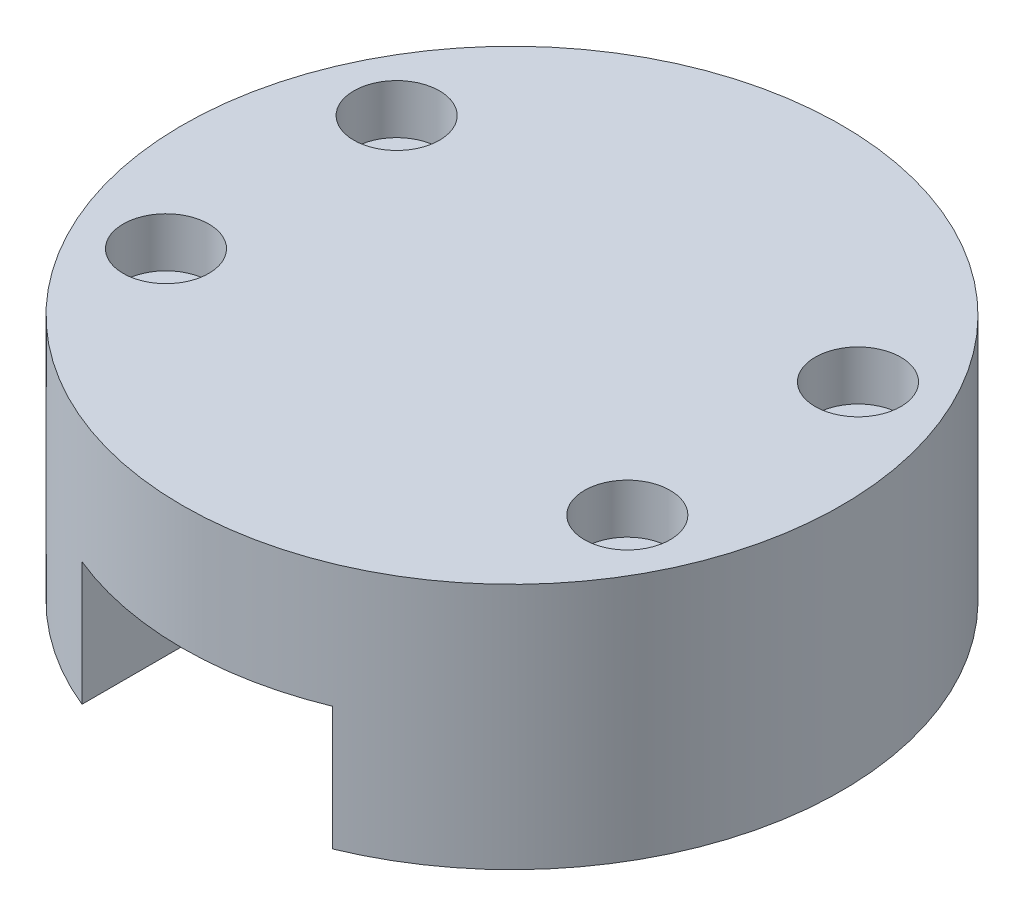
ISO-10303-21;
HEADER;
FILE_DESCRIPTION(('STEP AP214'),'2;1');
FILE_NAME('part.step','',(''),(''),'','','');
FILE_SCHEMA(('AUTOMOTIVE_DESIGN { 1 0 10303 214 1 1 1 1 }'));
ENDSEC;
DATA;
#1=APPLICATION_CONTEXT('core data for automotive mechanical design processes');
#2=APPLICATION_PROTOCOL_DEFINITION('international standard','automotive_design',2000,#1);
#3=PRODUCT_CONTEXT('',#1,'mechanical');
#4=PRODUCT('Part','Part','',(#3));
#5=PRODUCT_RELATED_PRODUCT_CATEGORY('part','',(#4));
#6=PRODUCT_DEFINITION_FORMATION('','',#4);
#7=PRODUCT_DEFINITION_CONTEXT('part definition',#1,'design');
#8=PRODUCT_DEFINITION('design','',#6,#7);
#9=PRODUCT_DEFINITION_SHAPE('','',#8);
#10=(LENGTH_UNIT() NAMED_UNIT(*) SI_UNIT(.MILLI.,.METRE.));
#11=(NAMED_UNIT(*) PLANE_ANGLE_UNIT() SI_UNIT($,.RADIAN.));
#12=(NAMED_UNIT(*) SI_UNIT($,.STERADIAN.) SOLID_ANGLE_UNIT());
#13=UNCERTAINTY_MEASURE_WITH_UNIT(LENGTH_MEASURE(1.E-05),#10,'distance_accuracy_value','');
#14=(GEOMETRIC_REPRESENTATION_CONTEXT(3) GLOBAL_UNCERTAINTY_ASSIGNED_CONTEXT((#13)) GLOBAL_UNIT_ASSIGNED_CONTEXT((#10,
#11,#12)) REPRESENTATION_CONTEXT('',''));
#15=CARTESIAN_POINT('',(0.,0.,0.));
#16=DIRECTION('',(0.,0.,1.));
#17=DIRECTION('',(1.,0.,0.));
#18=AXIS2_PLACEMENT_3D('',#15,#16,#17);
#19=CARTESIAN_POINT('',(-14.,15.001,7.));
#20=DIRECTION('',(0.,-1.,0.));
#21=DIRECTION('',(0.,0.,-1.));
#22=AXIS2_PLACEMENT_3D('',#19,#20,#21);
#23=CYLINDRICAL_SURFACE('',#22,1.5);
#24=CARTESIAN_POINT('',(-14.,0.,7.));
#25=DIRECTION('',(0.,-1.,0.));
#26=DIRECTION('',(0.,0.,-1.));
#27=AXIS2_PLACEMENT_3D('',#24,#25,#26);
#28=CIRCLE('',#27,1.5);
#29=CARTESIAN_POINT('',(-14.,0.,5.5));
#30=VERTEX_POINT('',#29);
#31=EDGE_CURVE('E83',#30,#30,#28,.T.);
#32=CARTESIAN_POINT('',(-14.,12.,7.));
#33=DIRECTION('',(0.,1.,0.));
#34=DIRECTION('',(0.,0.,1.));
#35=AXIS2_PLACEMENT_3D('',#32,#33,#34);
#36=CIRCLE('',#35,1.5);
#37=CARTESIAN_POINT('',(-14.,12.,5.5));
#38=VERTEX_POINT('',#37);
#39=EDGE_CURVE('E37',#38,#38,#36,.F.);
#40=CARTESIAN_POINT('',(-14.,0.,5.5));
#41=CARTESIAN_POINT('',(-14.,0.125,5.5));
#42=CARTESIAN_POINT('',(-14.,0.25,5.5));
#43=CARTESIAN_POINT('',(-14.,0.5,5.5));
#44=CARTESIAN_POINT('',(-14.,0.625000000000001,5.5));
#45=CARTESIAN_POINT('',(-14.,0.875000000000001,5.5));
#46=CARTESIAN_POINT('',(-14.,1.,5.5));
#47=CARTESIAN_POINT('',(-14.,1.25,5.5));
#48=CARTESIAN_POINT('',(-14.,1.375,5.5));
#49=CARTESIAN_POINT('',(-14.,1.625,5.5));
#50=CARTESIAN_POINT('',(-14.,1.75,5.5));
#51=CARTESIAN_POINT('',(-14.,2.,5.5));
#52=CARTESIAN_POINT('',(-14.,2.125,5.5));
#53=CARTESIAN_POINT('',(-14.,2.375,5.5));
#54=CARTESIAN_POINT('',(-14.,2.5,5.5));
#55=CARTESIAN_POINT('',(-14.,2.75,5.5));
#56=CARTESIAN_POINT('',(-14.,2.875,5.5));
#57=CARTESIAN_POINT('',(-14.,3.125,5.5));
#58=CARTESIAN_POINT('',(-14.,3.25,5.5));
#59=CARTESIAN_POINT('',(-14.,3.5,5.5));
#60=CARTESIAN_POINT('',(-14.,3.625,5.5));
#61=CARTESIAN_POINT('',(-14.,3.875,5.5));
#62=CARTESIAN_POINT('',(-14.,4.,5.5));
#63=CARTESIAN_POINT('',(-14.,4.25,5.5));
#64=CARTESIAN_POINT('',(-14.,4.375,5.5));
#65=CARTESIAN_POINT('',(-14.,4.625,5.5));
#66=CARTESIAN_POINT('',(-14.,4.75,5.5));
#67=CARTESIAN_POINT('',(-14.,5.,5.5));
#68=CARTESIAN_POINT('',(-14.,5.125,5.5));
#69=CARTESIAN_POINT('',(-14.,5.375,5.5));
#70=CARTESIAN_POINT('',(-14.,5.5,5.5));
#71=CARTESIAN_POINT('',(-14.,5.75,5.5));
#72=CARTESIAN_POINT('',(-14.,5.875,5.5));
#73=CARTESIAN_POINT('',(-14.,6.125,5.5));
#74=CARTESIAN_POINT('',(-14.,6.25,5.5));
#75=CARTESIAN_POINT('',(-14.,6.5,5.5));
#76=CARTESIAN_POINT('',(-14.,6.625,5.5));
#77=CARTESIAN_POINT('',(-14.,6.875,5.5));
#78=CARTESIAN_POINT('',(-14.,7.,5.5));
#79=CARTESIAN_POINT('',(-14.,7.25,5.5));
#80=CARTESIAN_POINT('',(-14.,7.375,5.5));
#81=CARTESIAN_POINT('',(-14.,7.625,5.5));
#82=CARTESIAN_POINT('',(-14.,7.75,5.5));
#83=CARTESIAN_POINT('',(-14.,8.,5.5));
#84=CARTESIAN_POINT('',(-14.,8.125,5.5));
#85=CARTESIAN_POINT('',(-14.,8.375,5.5));
#86=CARTESIAN_POINT('',(-14.,8.5,5.5));
#87=CARTESIAN_POINT('',(-14.,8.75,5.5));
#88=CARTESIAN_POINT('',(-14.,8.875,5.5));
#89=CARTESIAN_POINT('',(-14.,9.125,5.5));
#90=CARTESIAN_POINT('',(-14.,9.25,5.5));
#91=CARTESIAN_POINT('',(-14.,9.5,5.5));
#92=CARTESIAN_POINT('',(-14.,9.625,5.5));
#93=CARTESIAN_POINT('',(-14.,9.875,5.5));
#94=CARTESIAN_POINT('',(-14.,10.,5.5));
#95=CARTESIAN_POINT('',(-14.,10.25,5.5));
#96=CARTESIAN_POINT('',(-14.,10.375,5.5));
#97=CARTESIAN_POINT('',(-14.,10.625,5.5));
#98=CARTESIAN_POINT('',(-14.,10.75,5.5));
#99=CARTESIAN_POINT('',(-14.,11.,5.5));
#100=CARTESIAN_POINT('',(-14.,11.125,5.5));
#101=CARTESIAN_POINT('',(-14.,11.375,5.5));
#102=CARTESIAN_POINT('',(-14.,11.5,5.5));
#103=CARTESIAN_POINT('',(-14.,11.75,5.5));
#104=CARTESIAN_POINT('',(-14.,11.875,5.5));
#105=CARTESIAN_POINT('',(-14.,12.,5.5));
#106=B_SPLINE_CURVE_WITH_KNOTS('',3,(#40,#41,#42,#43,#44,#45,#46,#47,#48,#49,#50,#51,#52,#53,
#54,#55,#56,#57,#58,#59,#60,#61,#62,#63,#64,#65,#66,#67,#68,#69,#70,#71,#72,#73,#74,#75,#76,#77,
#78,#79,#80,#81,#82,#83,#84,#85,#86,#87,#88,#89,#90,#91,#92,#93,#94,#95,#96,#97,#98,#99,#100,
#101,#102,#103,#104,#105),.UNSPECIFIED.,.F.,.F.,(4,2,2,2,2,2,2,2,2,2,2,2,2,2,2,2,2,2,2,2,2,2,2,
2,2,2,2,2,2,2,2,2,4),(0.,0.375,0.750000000000001,1.125,1.5,1.875,2.25,2.625,3.,3.375,3.75,4.125,
4.5,4.875,5.25,5.625,6.,6.375,6.75,7.125,7.5,7.875,8.25,8.625,9.,9.375,9.75,10.125,10.5,10.875,
11.25,11.625,12.),.UNSPECIFIED.);
#107=EDGE_CURVE('BSEAM33',#30,#38,#106,.T.);
#108=ORIENTED_EDGE('',*,*,#31,.T.);
#109=ORIENTED_EDGE('',*,*,#39,.F.);
#110=ORIENTED_EDGE('',*,*,#107,.T.);
#111=ORIENTED_EDGE('',*,*,#107,.F.);
#112=EDGE_LOOP('',(#108,#110,#109,#111));
#113=FACE_BOUND('',#112,.T.);
#114=ADVANCED_FACE('F33',(#113),#23,.F.);
#115=CARTESIAN_POINT('',(14.,15.001,-7.));
#116=DIRECTION('',(0.,-1.,0.));
#117=DIRECTION('',(0.,0.,-1.));
#118=AXIS2_PLACEMENT_3D('',#115,#116,#117);
#119=CYLINDRICAL_SURFACE('',#118,1.5);
#120=CARTESIAN_POINT('',(14.,0.,-7.));
#121=DIRECTION('',(0.,-1.,0.));
#122=DIRECTION('',(0.,0.,-1.));
#123=AXIS2_PLACEMENT_3D('',#120,#121,#122);
#124=CIRCLE('',#123,1.5);
#125=CARTESIAN_POINT('',(14.,0.,-8.5));
#126=VERTEX_POINT('',#125);
#127=EDGE_CURVE('E117',#126,#126,#124,.T.);
#128=CARTESIAN_POINT('',(14.,12.,-7.));
#129=DIRECTION('',(0.,1.,0.));
#130=DIRECTION('',(0.,0.,1.));
#131=AXIS2_PLACEMENT_3D('',#128,#129,#130);
#132=CIRCLE('',#131,1.5);
#133=CARTESIAN_POINT('',(14.,12.,-8.5));
#134=VERTEX_POINT('',#133);
#135=EDGE_CURVE('E112',#134,#134,#132,.F.);
#136=CARTESIAN_POINT('',(14.,0.,-8.5));
#137=CARTESIAN_POINT('',(14.,0.125,-8.5));
#138=CARTESIAN_POINT('',(14.,0.25,-8.5));
#139=CARTESIAN_POINT('',(14.,0.5,-8.5));
#140=CARTESIAN_POINT('',(14.,0.625000000000001,-8.5));
#141=CARTESIAN_POINT('',(14.,0.875000000000001,-8.5));
#142=CARTESIAN_POINT('',(14.,1.,-8.5));
#143=CARTESIAN_POINT('',(14.,1.25,-8.5));
#144=CARTESIAN_POINT('',(14.,1.375,-8.5));
#145=CARTESIAN_POINT('',(14.,1.625,-8.5));
#146=CARTESIAN_POINT('',(14.,1.75,-8.5));
#147=CARTESIAN_POINT('',(14.,2.,-8.5));
#148=CARTESIAN_POINT('',(14.,2.125,-8.5));
#149=CARTESIAN_POINT('',(14.,2.375,-8.5));
#150=CARTESIAN_POINT('',(14.,2.5,-8.5));
#151=CARTESIAN_POINT('',(14.,2.75,-8.5));
#152=CARTESIAN_POINT('',(14.,2.875,-8.5));
#153=CARTESIAN_POINT('',(14.,3.125,-8.5));
#154=CARTESIAN_POINT('',(14.,3.25,-8.5));
#155=CARTESIAN_POINT('',(14.,3.5,-8.5));
#156=CARTESIAN_POINT('',(14.,3.625,-8.5));
#157=CARTESIAN_POINT('',(14.,3.875,-8.5));
#158=CARTESIAN_POINT('',(14.,4.,-8.5));
#159=CARTESIAN_POINT('',(14.,4.25,-8.5));
#160=CARTESIAN_POINT('',(14.,4.375,-8.5));
#161=CARTESIAN_POINT('',(14.,4.625,-8.5));
#162=CARTESIAN_POINT('',(14.,4.75,-8.5));
#163=CARTESIAN_POINT('',(14.,5.,-8.5));
#164=CARTESIAN_POINT('',(14.,5.125,-8.5));
#165=CARTESIAN_POINT('',(14.,5.375,-8.5));
#166=CARTESIAN_POINT('',(14.,5.5,-8.5));
#167=CARTESIAN_POINT('',(14.,5.75,-8.5));
#168=CARTESIAN_POINT('',(14.,5.875,-8.5));
#169=CARTESIAN_POINT('',(14.,6.125,-8.5));
#170=CARTESIAN_POINT('',(14.,6.25,-8.5));
#171=CARTESIAN_POINT('',(14.,6.5,-8.5));
#172=CARTESIAN_POINT('',(14.,6.625,-8.5));
#173=CARTESIAN_POINT('',(14.,6.875,-8.5));
#174=CARTESIAN_POINT('',(14.,7.,-8.5));
#175=CARTESIAN_POINT('',(14.,7.25,-8.5));
#176=CARTESIAN_POINT('',(14.,7.375,-8.5));
#177=CARTESIAN_POINT('',(14.,7.625,-8.5));
#178=CARTESIAN_POINT('',(14.,7.75,-8.5));
#179=CARTESIAN_POINT('',(14.,8.,-8.5));
#180=CARTESIAN_POINT('',(14.,8.125,-8.5));
#181=CARTESIAN_POINT('',(14.,8.375,-8.5));
#182=CARTESIAN_POINT('',(14.,8.5,-8.5));
#183=CARTESIAN_POINT('',(14.,8.75,-8.5));
#184=CARTESIAN_POINT('',(14.,8.875,-8.5));
#185=CARTESIAN_POINT('',(14.,9.125,-8.5));
#186=CARTESIAN_POINT('',(14.,9.25,-8.5));
#187=CARTESIAN_POINT('',(14.,9.5,-8.5));
#188=CARTESIAN_POINT('',(14.,9.625,-8.5));
#189=CARTESIAN_POINT('',(14.,9.875,-8.5));
#190=CARTESIAN_POINT('',(14.,10.,-8.5));
#191=CARTESIAN_POINT('',(14.,10.25,-8.5));
#192=CARTESIAN_POINT('',(14.,10.375,-8.5));
#193=CARTESIAN_POINT('',(14.,10.625,-8.5));
#194=CARTESIAN_POINT('',(14.,10.75,-8.5));
#195=CARTESIAN_POINT('',(14.,11.,-8.5));
#196=CARTESIAN_POINT('',(14.,11.125,-8.5));
#197=CARTESIAN_POINT('',(14.,11.375,-8.5));
#198=CARTESIAN_POINT('',(14.,11.5,-8.5));
#199=CARTESIAN_POINT('',(14.,11.75,-8.5));
#200=CARTESIAN_POINT('',(14.,11.875,-8.5));
#201=CARTESIAN_POINT('',(14.,12.,-8.5));
#202=B_SPLINE_CURVE_WITH_KNOTS('',3,(#136,#137,#138,#139,#140,#141,#142,#143,#144,#145,#146,
#147,#148,#149,#150,#151,#152,#153,#154,#155,#156,#157,#158,#159,#160,#161,#162,#163,#164,#165,
#166,#167,#168,#169,#170,#171,#172,#173,#174,#175,#176,#177,#178,#179,#180,#181,#182,#183,#184,
#185,#186,#187,#188,#189,#190,#191,#192,#193,#194,#195,#196,#197,#198,#199,#200,#201),
.UNSPECIFIED.,.F.,.F.,(4,2,2,2,2,2,2,2,2,2,2,2,2,2,2,2,2,2,2,2,2,2,2,2,2,2,2,2,2,2,2,2,4),(0.,
0.375,0.750000000000001,1.125,1.5,1.875,2.25,2.625,3.,3.375,3.75,4.125,4.5,4.875,5.25,5.625,6.,
6.375,6.75,7.125,7.5,7.875,8.25,8.625,9.,9.375,9.75,10.125,10.5,10.875,11.25,11.625,12.),.UNSPECIFIED.);
#203=EDGE_CURVE('BSEAM157',#126,#134,#202,.T.);
#204=ORIENTED_EDGE('',*,*,#127,.T.);
#205=ORIENTED_EDGE('',*,*,#135,.F.);
#206=ORIENTED_EDGE('',*,*,#203,.T.);
#207=ORIENTED_EDGE('',*,*,#203,.F.);
#208=EDGE_LOOP('',(#204,#206,#205,#207));
#209=FACE_BOUND('',#208,.T.);
#210=ADVANCED_FACE('F157',(#209),#119,.F.);
#211=CARTESIAN_POINT('',(14.,15.001,7.));
#212=DIRECTION('',(0.,-1.,0.));
#213=DIRECTION('',(0.,0.,-1.));
#214=AXIS2_PLACEMENT_3D('',#211,#212,#213);
#215=CYLINDRICAL_SURFACE('',#214,1.5);
#216=CARTESIAN_POINT('',(14.,0.,7.));
#217=DIRECTION('',(0.,-1.,0.));
#218=DIRECTION('',(0.,0.,-1.));
#219=AXIS2_PLACEMENT_3D('',#216,#217,#218);
#220=CIRCLE('',#219,1.5);
#221=CARTESIAN_POINT('',(14.,0.,5.5));
#222=VERTEX_POINT('',#221);
#223=EDGE_CURVE('E121',#222,#222,#220,.T.);
#224=CARTESIAN_POINT('',(14.,12.,7.));
#225=DIRECTION('',(0.,1.,0.));
#226=DIRECTION('',(0.,0.,1.));
#227=AXIS2_PLACEMENT_3D('',#224,#225,#226);
#228=CIRCLE('',#227,1.5);
#229=CARTESIAN_POINT('',(14.,12.,5.5));
#230=VERTEX_POINT('',#229);
#231=EDGE_CURVE('E109',#230,#230,#228,.F.);
#232=CARTESIAN_POINT('',(14.,0.,5.5));
#233=CARTESIAN_POINT('',(14.,0.125,5.5));
#234=CARTESIAN_POINT('',(14.,0.25,5.5));
#235=CARTESIAN_POINT('',(14.,0.5,5.5));
#236=CARTESIAN_POINT('',(14.,0.625000000000001,5.5));
#237=CARTESIAN_POINT('',(14.,0.875000000000001,5.5));
#238=CARTESIAN_POINT('',(14.,1.,5.5));
#239=CARTESIAN_POINT('',(14.,1.25,5.5));
#240=CARTESIAN_POINT('',(14.,1.375,5.5));
#241=CARTESIAN_POINT('',(14.,1.625,5.5));
#242=CARTESIAN_POINT('',(14.,1.75,5.5));
#243=CARTESIAN_POINT('',(14.,2.,5.5));
#244=CARTESIAN_POINT('',(14.,2.125,5.5));
#245=CARTESIAN_POINT('',(14.,2.375,5.5));
#246=CARTESIAN_POINT('',(14.,2.5,5.5));
#247=CARTESIAN_POINT('',(14.,2.75,5.5));
#248=CARTESIAN_POINT('',(14.,2.875,5.5));
#249=CARTESIAN_POINT('',(14.,3.125,5.5));
#250=CARTESIAN_POINT('',(14.,3.25,5.5));
#251=CARTESIAN_POINT('',(14.,3.5,5.5));
#252=CARTESIAN_POINT('',(14.,3.625,5.5));
#253=CARTESIAN_POINT('',(14.,3.875,5.5));
#254=CARTESIAN_POINT('',(14.,4.,5.5));
#255=CARTESIAN_POINT('',(14.,4.25,5.5));
#256=CARTESIAN_POINT('',(14.,4.375,5.5));
#257=CARTESIAN_POINT('',(14.,4.625,5.5));
#258=CARTESIAN_POINT('',(14.,4.75,5.5));
#259=CARTESIAN_POINT('',(14.,5.,5.5));
#260=CARTESIAN_POINT('',(14.,5.125,5.5));
#261=CARTESIAN_POINT('',(14.,5.375,5.5));
#262=CARTESIAN_POINT('',(14.,5.5,5.5));
#263=CARTESIAN_POINT('',(14.,5.75,5.5));
#264=CARTESIAN_POINT('',(14.,5.875,5.5));
#265=CARTESIAN_POINT('',(14.,6.125,5.5));
#266=CARTESIAN_POINT('',(14.,6.25,5.5));
#267=CARTESIAN_POINT('',(14.,6.5,5.5));
#268=CARTESIAN_POINT('',(14.,6.625,5.5));
#269=CARTESIAN_POINT('',(14.,6.875,5.5));
#270=CARTESIAN_POINT('',(14.,7.,5.5));
#271=CARTESIAN_POINT('',(14.,7.25,5.5));
#272=CARTESIAN_POINT('',(14.,7.375,5.5));
#273=CARTESIAN_POINT('',(14.,7.625,5.5));
#274=CARTESIAN_POINT('',(14.,7.75,5.5));
#275=CARTESIAN_POINT('',(14.,8.,5.5));
#276=CARTESIAN_POINT('',(14.,8.125,5.5));
#277=CARTESIAN_POINT('',(14.,8.375,5.5));
#278=CARTESIAN_POINT('',(14.,8.5,5.5));
#279=CARTESIAN_POINT('',(14.,8.75,5.5));
#280=CARTESIAN_POINT('',(14.,8.875,5.5));
#281=CARTESIAN_POINT('',(14.,9.125,5.5));
#282=CARTESIAN_POINT('',(14.,9.25,5.5));
#283=CARTESIAN_POINT('',(14.,9.5,5.5));
#284=CARTESIAN_POINT('',(14.,9.625,5.5));
#285=CARTESIAN_POINT('',(14.,9.875,5.5));
#286=CARTESIAN_POINT('',(14.,10.,5.5));
#287=CARTESIAN_POINT('',(14.,10.25,5.5));
#288=CARTESIAN_POINT('',(14.,10.375,5.5));
#289=CARTESIAN_POINT('',(14.,10.625,5.5));
#290=CARTESIAN_POINT('',(14.,10.75,5.5));
#291=CARTESIAN_POINT('',(14.,11.,5.5));
#292=CARTESIAN_POINT('',(14.,11.125,5.5));
#293=CARTESIAN_POINT('',(14.,11.375,5.5));
#294=CARTESIAN_POINT('',(14.,11.5,5.5));
#295=CARTESIAN_POINT('',(14.,11.75,5.5));
#296=CARTESIAN_POINT('',(14.,11.875,5.5));
#297=CARTESIAN_POINT('',(14.,12.,5.5));
#298=B_SPLINE_CURVE_WITH_KNOTS('',3,(#232,#233,#234,#235,#236,#237,#238,#239,#240,#241,#242,
#243,#244,#245,#246,#247,#248,#249,#250,#251,#252,#253,#254,#255,#256,#257,#258,#259,#260,#261,
#262,#263,#264,#265,#266,#267,#268,#269,#270,#271,#272,#273,#274,#275,#276,#277,#278,#279,#280,
#281,#282,#283,#284,#285,#286,#287,#288,#289,#290,#291,#292,#293,#294,#295,#296,#297),
.UNSPECIFIED.,.F.,.F.,(4,2,2,2,2,2,2,2,2,2,2,2,2,2,2,2,2,2,2,2,2,2,2,2,2,2,2,2,2,2,2,2,4),(0.,
0.375,0.750000000000001,1.125,1.5,1.875,2.25,2.625,3.,3.375,3.75,4.125,4.5,4.875,5.25,5.625,6.,
6.375,6.75,7.125,7.5,7.875,8.25,8.625,9.,9.375,9.75,10.125,10.5,10.875,11.25,11.625,12.),.UNSPECIFIED.);
#299=EDGE_CURVE('BSEAM163',#222,#230,#298,.T.);
#300=ORIENTED_EDGE('',*,*,#223,.T.);
#301=ORIENTED_EDGE('',*,*,#231,.F.);
#302=ORIENTED_EDGE('',*,*,#299,.T.);
#303=ORIENTED_EDGE('',*,*,#299,.F.);
#304=EDGE_LOOP('',(#300,#302,#301,#303));
#305=FACE_BOUND('',#304,.T.);
#306=ADVANCED_FACE('F163',(#305),#215,.F.);
#307=CARTESIAN_POINT('',(-14.,15.001,-7.));
#308=DIRECTION('',(0.,-1.,0.));
#309=DIRECTION('',(0.,0.,-1.));
#310=AXIS2_PLACEMENT_3D('',#307,#308,#309);
#311=CYLINDRICAL_SURFACE('',#310,1.5);
#312=CARTESIAN_POINT('',(-14.,0.,-7.));
#313=DIRECTION('',(0.,-1.,0.));
#314=DIRECTION('',(0.,0.,-1.));
#315=AXIS2_PLACEMENT_3D('',#312,#313,#314);
#316=CIRCLE('',#315,1.5);
#317=CARTESIAN_POINT('',(-14.,0.,-8.5));
#318=VERTEX_POINT('',#317);
#319=EDGE_CURVE('E126',#318,#318,#316,.T.);
#320=CARTESIAN_POINT('',(-14.,12.,-7.));
#321=DIRECTION('',(0.,1.,0.));
#322=DIRECTION('',(0.,0.,1.));
#323=AXIS2_PLACEMENT_3D('',#320,#321,#322);
#324=CIRCLE('',#323,1.5);
#325=CARTESIAN_POINT('',(-14.,12.,-8.5));
#326=VERTEX_POINT('',#325);
#327=EDGE_CURVE('E106',#326,#326,#324,.F.);
#328=CARTESIAN_POINT('',(-14.,0.,-8.5));
#329=CARTESIAN_POINT('',(-14.,0.125,-8.5));
#330=CARTESIAN_POINT('',(-14.,0.25,-8.5));
#331=CARTESIAN_POINT('',(-14.,0.5,-8.5));
#332=CARTESIAN_POINT('',(-14.,0.625000000000001,-8.5));
#333=CARTESIAN_POINT('',(-14.,0.875000000000001,-8.5));
#334=CARTESIAN_POINT('',(-14.,1.,-8.5));
#335=CARTESIAN_POINT('',(-14.,1.25,-8.5));
#336=CARTESIAN_POINT('',(-14.,1.375,-8.5));
#337=CARTESIAN_POINT('',(-14.,1.625,-8.5));
#338=CARTESIAN_POINT('',(-14.,1.75,-8.5));
#339=CARTESIAN_POINT('',(-14.,2.,-8.5));
#340=CARTESIAN_POINT('',(-14.,2.125,-8.5));
#341=CARTESIAN_POINT('',(-14.,2.375,-8.5));
#342=CARTESIAN_POINT('',(-14.,2.5,-8.5));
#343=CARTESIAN_POINT('',(-14.,2.75,-8.5));
#344=CARTESIAN_POINT('',(-14.,2.875,-8.5));
#345=CARTESIAN_POINT('',(-14.,3.125,-8.5));
#346=CARTESIAN_POINT('',(-14.,3.25,-8.5));
#347=CARTESIAN_POINT('',(-14.,3.5,-8.5));
#348=CARTESIAN_POINT('',(-14.,3.625,-8.5));
#349=CARTESIAN_POINT('',(-14.,3.875,-8.5));
#350=CARTESIAN_POINT('',(-14.,4.,-8.5));
#351=CARTESIAN_POINT('',(-14.,4.25,-8.5));
#352=CARTESIAN_POINT('',(-14.,4.375,-8.5));
#353=CARTESIAN_POINT('',(-14.,4.625,-8.5));
#354=CARTESIAN_POINT('',(-14.,4.75,-8.5));
#355=CARTESIAN_POINT('',(-14.,5.,-8.5));
#356=CARTESIAN_POINT('',(-14.,5.125,-8.5));
#357=CARTESIAN_POINT('',(-14.,5.375,-8.5));
#358=CARTESIAN_POINT('',(-14.,5.5,-8.5));
#359=CARTESIAN_POINT('',(-14.,5.75,-8.5));
#360=CARTESIAN_POINT('',(-14.,5.875,-8.5));
#361=CARTESIAN_POINT('',(-14.,6.125,-8.5));
#362=CARTESIAN_POINT('',(-14.,6.25,-8.5));
#363=CARTESIAN_POINT('',(-14.,6.5,-8.5));
#364=CARTESIAN_POINT('',(-14.,6.625,-8.5));
#365=CARTESIAN_POINT('',(-14.,6.875,-8.5));
#366=CARTESIAN_POINT('',(-14.,7.,-8.5));
#367=CARTESIAN_POINT('',(-14.,7.25,-8.5));
#368=CARTESIAN_POINT('',(-14.,7.375,-8.5));
#369=CARTESIAN_POINT('',(-14.,7.625,-8.5));
#370=CARTESIAN_POINT('',(-14.,7.75,-8.5));
#371=CARTESIAN_POINT('',(-14.,8.,-8.5));
#372=CARTESIAN_POINT('',(-14.,8.125,-8.5));
#373=CARTESIAN_POINT('',(-14.,8.375,-8.5));
#374=CARTESIAN_POINT('',(-14.,8.5,-8.5));
#375=CARTESIAN_POINT('',(-14.,8.75,-8.5));
#376=CARTESIAN_POINT('',(-14.,8.875,-8.5));
#377=CARTESIAN_POINT('',(-14.,9.125,-8.5));
#378=CARTESIAN_POINT('',(-14.,9.25,-8.5));
#379=CARTESIAN_POINT('',(-14.,9.5,-8.5));
#380=CARTESIAN_POINT('',(-14.,9.625,-8.5));
#381=CARTESIAN_POINT('',(-14.,9.875,-8.5));
#382=CARTESIAN_POINT('',(-14.,10.,-8.5));
#383=CARTESIAN_POINT('',(-14.,10.25,-8.5));
#384=CARTESIAN_POINT('',(-14.,10.375,-8.5));
#385=CARTESIAN_POINT('',(-14.,10.625,-8.5));
#386=CARTESIAN_POINT('',(-14.,10.75,-8.5));
#387=CARTESIAN_POINT('',(-14.,11.,-8.5));
#388=CARTESIAN_POINT('',(-14.,11.125,-8.5));
#389=CARTESIAN_POINT('',(-14.,11.375,-8.5));
#390=CARTESIAN_POINT('',(-14.,11.5,-8.5));
#391=CARTESIAN_POINT('',(-14.,11.75,-8.5));
#392=CARTESIAN_POINT('',(-14.,11.875,-8.5));
#393=CARTESIAN_POINT('',(-14.,12.,-8.5));
#394=B_SPLINE_CURVE_WITH_KNOTS('',3,(#328,#329,#330,#331,#332,#333,#334,#335,#336,#337,#338,
#339,#340,#341,#342,#343,#344,#345,#346,#347,#348,#349,#350,#351,#352,#353,#354,#355,#356,#357,
#358,#359,#360,#361,#362,#363,#364,#365,#366,#367,#368,#369,#370,#371,#372,#373,#374,#375,#376,
#377,#378,#379,#380,#381,#382,#383,#384,#385,#386,#387,#388,#389,#390,#391,#392,#393),
.UNSPECIFIED.,.F.,.F.,(4,2,2,2,2,2,2,2,2,2,2,2,2,2,2,2,2,2,2,2,2,2,2,2,2,2,2,2,2,2,2,2,4),(0.,
0.375,0.750000000000001,1.125,1.5,1.875,2.25,2.625,3.,3.375,3.75,4.125,4.5,4.875,5.25,5.625,6.,
6.375,6.75,7.125,7.5,7.875,8.25,8.625,9.,9.375,9.75,10.125,10.5,10.875,11.25,11.625,12.),.UNSPECIFIED.);
#395=EDGE_CURVE('BSEAM151',#318,#326,#394,.T.);
#396=ORIENTED_EDGE('',*,*,#319,.T.);
#397=ORIENTED_EDGE('',*,*,#327,.F.);
#398=ORIENTED_EDGE('',*,*,#395,.T.);
#399=ORIENTED_EDGE('',*,*,#395,.F.);
#400=EDGE_LOOP('',(#396,#398,#397,#399));
#401=FACE_BOUND('',#400,.T.);
#402=ADVANCED_FACE('F151',(#401),#311,.F.);
#403=CARTESIAN_POINT('',(0.,15.,0.));
#404=DIRECTION('',(0.,-1.,0.));
#405=DIRECTION('',(0.,0.,-1.));
#406=AXIS2_PLACEMENT_3D('',#403,#404,#405);
#407=CYLINDRICAL_SURFACE('',#406,20.);
#408=CARTESIAN_POINT('',(0.,15.,0.));
#409=DIRECTION('',(0.,1.,0.));
#410=DIRECTION('',(0.,0.,1.));
#411=AXIS2_PLACEMENT_3D('',#408,#409,#410);
#412=CIRCLE('',#411,20.);
#413=CARTESIAN_POINT('',(0.,15.,20.));
#414=VERTEX_POINT('',#413);
#415=EDGE_CURVE('E96',#414,#414,#412,.T.);
#416=ORIENTED_EDGE('',*,*,#415,.F.);
#417=EDGE_LOOP('',(#416));
#418=FACE_BOUND('',#417,.T.);
#419=DIRECTION('',(0.,-1.,0.));
#420=VECTOR('',#419,1.);
#421=CARTESIAN_POINT('',(7.6,15.,18.4997297277555));
#422=LINE('',#421,#420);
#423=CARTESIAN_POINT('',(7.6,0.,18.4997297277555));
#424=VERTEX_POINT('',#423);
#425=CARTESIAN_POINT('',(7.6,7.5,18.4997297277555));
#426=VERTEX_POINT('',#425);
#427=EDGE_CURVE('E88',#424,#426,#422,.F.);
#428=ORIENTED_EDGE('',*,*,#427,.F.);
#429=CARTESIAN_POINT('',(0.,0.,0.));
#430=DIRECTION('',(0.,1.,0.));
#431=DIRECTION('',(0.,0.,1.));
#432=AXIS2_PLACEMENT_3D('',#429,#430,#431);
#433=CIRCLE('',#432,20.);
#434=CARTESIAN_POINT('',(7.6,0.,-18.4997297277555));
#435=VERTEX_POINT('',#434);
#436=EDGE_CURVE('E100',#424,#435,#433,.T.);
#437=ORIENTED_EDGE('',*,*,#436,.T.);
#438=DIRECTION('',(0.,-1.,0.));
#439=VECTOR('',#438,1.);
#440=CARTESIAN_POINT('',(7.6,15.,-18.4997297277555));
#441=LINE('',#440,#439);
#442=CARTESIAN_POINT('',(7.6,7.5,-18.4997297277555));
#443=VERTEX_POINT('',#442);
#444=EDGE_CURVE('E90',#443,#435,#441,.T.);
#445=ORIENTED_EDGE('',*,*,#444,.F.);
#446=CARTESIAN_POINT('',(0.,7.5,0.));
#447=DIRECTION('',(0.,-1.,0.));
#448=DIRECTION('',(0.,0.,-1.));
#449=AXIS2_PLACEMENT_3D('',#446,#447,#448);
#450=CIRCLE('',#449,20.);
#451=CARTESIAN_POINT('',(-7.6,7.5,-18.4997297277555));
#452=VERTEX_POINT('',#451);
#453=EDGE_CURVE('E42',#452,#443,#450,.T.);
#454=ORIENTED_EDGE('',*,*,#453,.F.);
#455=DIRECTION('',(0.,-1.,0.));
#456=VECTOR('',#455,1.);
#457=CARTESIAN_POINT('',(-7.6,15.,-18.4997297277555));
#458=LINE('',#457,#456);
#459=CARTESIAN_POINT('',(-7.6,0.,-18.4997297277555));
#460=VERTEX_POINT('',#459);
#461=EDGE_CURVE('E82',#460,#452,#458,.F.);
#462=ORIENTED_EDGE('',*,*,#461,.F.);
#463=CARTESIAN_POINT('',(-7.6,0.,18.4997297277555));
#464=VERTEX_POINT('',#463);
#465=EDGE_CURVE('E87',#460,#464,#433,.T.);
#466=ORIENTED_EDGE('',*,*,#465,.T.);
#467=DIRECTION('',(0.,-1.,0.));
#468=VECTOR('',#467,1.);
#469=CARTESIAN_POINT('',(-7.6,15.,18.4997297277555));
#470=LINE('',#469,#468);
#471=CARTESIAN_POINT('',(-7.6,7.5,18.4997297277555));
#472=VERTEX_POINT('',#471);
#473=EDGE_CURVE('E50',#472,#464,#470,.T.);
#474=ORIENTED_EDGE('',*,*,#473,.F.);
#475=EDGE_CURVE('E11',#426,#472,#450,.T.);
#476=ORIENTED_EDGE('',*,*,#475,.F.);
#477=EDGE_LOOP('',(#428,#437,#445,#454,#462,#466,#474,#476));
#478=FACE_BOUND('',#477,.T.);
#479=ADVANCED_FACE('F35',(#418,#478),#407,.T.);
#480=CARTESIAN_POINT('',(0.,0.,0.));
#481=DIRECTION('',(0.,1.,0.));
#482=DIRECTION('',(0.,0.,1.));
#483=AXIS2_PLACEMENT_3D('',#480,#481,#482);
#484=PLANE('',#483);
#485=ORIENTED_EDGE('',*,*,#223,.F.);
#486=EDGE_LOOP('',(#485));
#487=FACE_BOUND('',#486,.T.);
#488=ORIENTED_EDGE('',*,*,#127,.F.);
#489=EDGE_LOOP('',(#488));
#490=FACE_BOUND('',#489,.T.);
#491=DIRECTION('',(0.,0.,1.));
#492=VECTOR('',#491,1.);
#493=CARTESIAN_POINT('',(7.6,0.,0.));
#494=LINE('',#493,#492);
#495=EDGE_CURVE('E104',#435,#424,#494,.T.);
#496=ORIENTED_EDGE('',*,*,#495,.F.);
#497=ORIENTED_EDGE('',*,*,#436,.F.);
#498=EDGE_LOOP('',(#496,#497));
#499=FACE_BOUND('',#498,.T.);
#500=ADVANCED_FACE('F141',(#487,#490,#499),#484,.F.);
#501=ORIENTED_EDGE('',*,*,#319,.F.);
#502=EDGE_LOOP('',(#501));
#503=FACE_BOUND('',#502,.T.);
#504=ORIENTED_EDGE('',*,*,#31,.F.);
#505=EDGE_LOOP('',(#504));
#506=FACE_BOUND('',#505,.T.);
#507=DIRECTION('',(0.,0.,-1.));
#508=VECTOR('',#507,1.);
#509=CARTESIAN_POINT('',(-7.6,0.,0.));
#510=LINE('',#509,#508);
#511=EDGE_CURVE('E99',#464,#460,#510,.T.);
#512=ORIENTED_EDGE('',*,*,#511,.F.);
#513=ORIENTED_EDGE('',*,*,#465,.F.);
#514=EDGE_LOOP('',(#512,#513));
#515=FACE_BOUND('',#514,.T.);
#516=ADVANCED_FACE('F143',(#503,#506,#515),#484,.F.);
#517=CARTESIAN_POINT('',(0.,15.,0.));
#518=DIRECTION('',(0.,1.,0.));
#519=DIRECTION('',(0.,0.,1.));
#520=AXIS2_PLACEMENT_3D('',#517,#518,#519);
#521=PLANE('',#520);
#522=CARTESIAN_POINT('',(-14.,15.,7.));
#523=DIRECTION('',(0.,1.,0.));
#524=DIRECTION('',(0.,0.,1.));
#525=AXIS2_PLACEMENT_3D('',#522,#523,#524);
#526=CIRCLE('',#525,2.6);
#527=CARTESIAN_POINT('',(-14.,15.,9.6));
#528=VERTEX_POINT('',#527);
#529=EDGE_CURVE('E182',#528,#528,#526,.T.);
#530=ORIENTED_EDGE('',*,*,#529,.F.);
#531=EDGE_LOOP('',(#530));
#532=FACE_BOUND('',#531,.T.);
#533=CARTESIAN_POINT('',(14.,15.,-7.));
#534=DIRECTION('',(0.,1.,0.));
#535=DIRECTION('',(0.,0.,1.));
#536=AXIS2_PLACEMENT_3D('',#533,#534,#535);
#537=CIRCLE('',#536,2.6);
#538=CARTESIAN_POINT('',(14.,15.,-4.4));
#539=VERTEX_POINT('',#538);
#540=EDGE_CURVE('E186',#539,#539,#537,.T.);
#541=ORIENTED_EDGE('',*,*,#540,.F.);
#542=EDGE_LOOP('',(#541));
#543=FACE_BOUND('',#542,.T.);
#544=CARTESIAN_POINT('',(14.,15.,7.));
#545=DIRECTION('',(0.,1.,0.));
#546=DIRECTION('',(0.,0.,1.));
#547=AXIS2_PLACEMENT_3D('',#544,#545,#546);
#548=CIRCLE('',#547,2.6);
#549=CARTESIAN_POINT('',(14.,15.,9.6));
#550=VERTEX_POINT('',#549);
#551=EDGE_CURVE('E190',#550,#550,#548,.T.);
#552=ORIENTED_EDGE('',*,*,#551,.F.);
#553=EDGE_LOOP('',(#552));
#554=FACE_BOUND('',#553,.T.);
#555=CARTESIAN_POINT('',(-14.,15.,-7.));
#556=DIRECTION('',(0.,1.,0.));
#557=DIRECTION('',(0.,0.,1.));
#558=AXIS2_PLACEMENT_3D('',#555,#556,#557);
#559=CIRCLE('',#558,2.6);
#560=CARTESIAN_POINT('',(-14.,15.,-4.4));
#561=VERTEX_POINT('',#560);
#562=EDGE_CURVE('E130',#561,#561,#559,.T.);
#563=ORIENTED_EDGE('',*,*,#562,.F.);
#564=EDGE_LOOP('',(#563));
#565=FACE_BOUND('',#564,.T.);
#566=ORIENTED_EDGE('',*,*,#415,.T.);
#567=EDGE_LOOP('',(#566));
#568=FACE_BOUND('',#567,.T.);
#569=ADVANCED_FACE('F149',(#532,#543,#554,#565,#568),#521,.T.);
#570=CARTESIAN_POINT('',(-7.6,7.5,25.));
#571=DIRECTION('',(0.,-1.,0.));
#572=DIRECTION('',(0.,0.,-1.));
#573=AXIS2_PLACEMENT_3D('',#570,#571,#572);
#574=PLANE('',#573);
#575=ORIENTED_EDGE('',*,*,#475,.T.);
#576=DIRECTION('',(0.,0.,-1.));
#577=VECTOR('',#576,1.);
#578=CARTESIAN_POINT('',(-7.6,7.5,25.));
#579=LINE('',#578,#577);
#580=EDGE_CURVE('E76',#472,#452,#579,.T.);
#581=ORIENTED_EDGE('',*,*,#580,.T.);
#582=ORIENTED_EDGE('',*,*,#453,.T.);
#583=DIRECTION('',(0.,0.,-1.));
#584=VECTOR('',#583,1.);
#585=CARTESIAN_POINT('',(7.6,7.5,25.));
#586=LINE('',#585,#584);
#587=EDGE_CURVE('E77',#426,#443,#586,.T.);
#588=ORIENTED_EDGE('',*,*,#587,.F.);
#589=EDGE_LOOP('',(#575,#581,#582,#588));
#590=FACE_BOUND('',#589,.T.);
#591=ADVANCED_FACE('F75',(#590),#574,.T.);
#592=CARTESIAN_POINT('',(7.6,7.5,25.));
#593=DIRECTION('',(-1.,0.,0.));
#594=DIRECTION('',(0.,-1.,0.));
#595=AXIS2_PLACEMENT_3D('',#592,#593,#594);
#596=PLANE('',#595);
#597=ORIENTED_EDGE('',*,*,#444,.T.);
#598=ORIENTED_EDGE('',*,*,#495,.T.);
#599=ORIENTED_EDGE('',*,*,#427,.T.);
#600=ORIENTED_EDGE('',*,*,#587,.T.);
#601=EDGE_LOOP('',(#597,#598,#599,#600));
#602=FACE_BOUND('',#601,.T.);
#603=ADVANCED_FACE('F137',(#602),#596,.T.);
#604=CARTESIAN_POINT('',(-7.6,0.,25.));
#605=DIRECTION('',(1.,0.,0.));
#606=DIRECTION('',(0.,0.,-1.));
#607=AXIS2_PLACEMENT_3D('',#604,#605,#606);
#608=PLANE('',#607);
#609=ORIENTED_EDGE('',*,*,#473,.T.);
#610=ORIENTED_EDGE('',*,*,#511,.T.);
#611=ORIENTED_EDGE('',*,*,#461,.T.);
#612=ORIENTED_EDGE('',*,*,#580,.F.);
#613=EDGE_LOOP('',(#609,#610,#611,#612));
#614=FACE_BOUND('',#613,.T.);
#615=ADVANCED_FACE('F80',(#614),#608,.T.);
#616=CARTESIAN_POINT('',(-14.,12.,-7.));
#617=DIRECTION('',(0.,1.,0.));
#618=DIRECTION('',(0.,0.,1.));
#619=AXIS2_PLACEMENT_3D('',#616,#617,#618);
#620=PLANE('',#619);
#621=CARTESIAN_POINT('',(-14.,12.,-7.));
#622=DIRECTION('',(0.,1.,0.));
#623=DIRECTION('',(0.,0.,1.));
#624=AXIS2_PLACEMENT_3D('',#621,#622,#623);
#625=CIRCLE('',#624,2.6);
#626=CARTESIAN_POINT('',(-14.,12.,-4.4));
#627=VERTEX_POINT('',#626);
#628=EDGE_CURVE('E110',#627,#627,#625,.T.);
#629=ORIENTED_EDGE('',*,*,#628,.T.);
#630=EDGE_LOOP('',(#629));
#631=FACE_BOUND('',#630,.T.);
#632=ORIENTED_EDGE('',*,*,#327,.T.);
#633=EDGE_LOOP('',(#632));
#634=FACE_BOUND('',#633,.T.);
#635=ADVANCED_FACE('F171',(#631,#634),#620,.T.);
#636=CARTESIAN_POINT('',(-14.,12.,-7.));
#637=DIRECTION('',(0.,1.,0.));
#638=DIRECTION('',(0.,0.,1.));
#639=AXIS2_PLACEMENT_3D('',#636,#637,#638);
#640=CYLINDRICAL_SURFACE('',#639,2.6);
#641=ORIENTED_EDGE('',*,*,#628,.F.);
#642=EDGE_LOOP('',(#641));
#643=FACE_BOUND('',#642,.T.);
#644=ORIENTED_EDGE('',*,*,#562,.T.);
#645=EDGE_LOOP('',(#644));
#646=FACE_BOUND('',#645,.T.);
#647=ADVANCED_FACE('F228',(#643,#646),#640,.F.);
#648=CARTESIAN_POINT('',(14.,12.,7.));
#649=DIRECTION('',(0.,1.,0.));
#650=DIRECTION('',(0.,0.,1.));
#651=AXIS2_PLACEMENT_3D('',#648,#649,#650);
#652=PLANE('',#651);
#653=CARTESIAN_POINT('',(14.,12.,7.));
#654=DIRECTION('',(0.,1.,0.));
#655=DIRECTION('',(0.,0.,1.));
#656=AXIS2_PLACEMENT_3D('',#653,#654,#655);
#657=CIRCLE('',#656,2.6);
#658=CARTESIAN_POINT('',(14.,12.,9.6));
#659=VERTEX_POINT('',#658);
#660=EDGE_CURVE('E209',#659,#659,#657,.T.);
#661=ORIENTED_EDGE('',*,*,#660,.T.);
#662=EDGE_LOOP('',(#661));
#663=FACE_BOUND('',#662,.T.);
#664=ORIENTED_EDGE('',*,*,#231,.T.);
#665=EDGE_LOOP('',(#664));
#666=FACE_BOUND('',#665,.T.);
#667=ADVANCED_FACE('F218',(#663,#666),#652,.T.);
#668=CARTESIAN_POINT('',(14.,12.,7.));
#669=DIRECTION('',(0.,1.,0.));
#670=DIRECTION('',(0.,0.,1.));
#671=AXIS2_PLACEMENT_3D('',#668,#669,#670);
#672=CYLINDRICAL_SURFACE('',#671,2.6);
#673=ORIENTED_EDGE('',*,*,#660,.F.);
#674=EDGE_LOOP('',(#673));
#675=FACE_BOUND('',#674,.T.);
#676=ORIENTED_EDGE('',*,*,#551,.T.);
#677=EDGE_LOOP('',(#676));
#678=FACE_BOUND('',#677,.T.);
#679=ADVANCED_FACE('F215',(#675,#678),#672,.F.);
#680=CARTESIAN_POINT('',(14.,12.,-7.));
#681=DIRECTION('',(0.,1.,0.));
#682=DIRECTION('',(0.,0.,1.));
#683=AXIS2_PLACEMENT_3D('',#680,#681,#682);
#684=PLANE('',#683);
#685=CARTESIAN_POINT('',(14.,12.,-7.));
#686=DIRECTION('',(0.,1.,0.));
#687=DIRECTION('',(0.,0.,1.));
#688=AXIS2_PLACEMENT_3D('',#685,#686,#687);
#689=CIRCLE('',#688,2.6);
#690=CARTESIAN_POINT('',(14.,12.,-4.4));
#691=VERTEX_POINT('',#690);
#692=EDGE_CURVE('E202',#691,#691,#689,.T.);
#693=ORIENTED_EDGE('',*,*,#692,.T.);
#694=EDGE_LOOP('',(#693));
#695=FACE_BOUND('',#694,.T.);
#696=ORIENTED_EDGE('',*,*,#135,.T.);
#697=EDGE_LOOP('',(#696));
#698=FACE_BOUND('',#697,.T.);
#699=ADVANCED_FACE('F217',(#695,#698),#684,.T.);
#700=CARTESIAN_POINT('',(14.,12.,-7.));
#701=DIRECTION('',(0.,1.,0.));
#702=DIRECTION('',(0.,0.,1.));
#703=AXIS2_PLACEMENT_3D('',#700,#701,#702);
#704=CYLINDRICAL_SURFACE('',#703,2.6);
#705=ORIENTED_EDGE('',*,*,#692,.F.);
#706=EDGE_LOOP('',(#705));
#707=FACE_BOUND('',#706,.T.);
#708=ORIENTED_EDGE('',*,*,#540,.T.);
#709=EDGE_LOOP('',(#708));
#710=FACE_BOUND('',#709,.T.);
#711=ADVANCED_FACE('F225',(#707,#710),#704,.F.);
#712=CARTESIAN_POINT('',(-14.,12.,7.));
#713=DIRECTION('',(0.,1.,0.));
#714=DIRECTION('',(0.,0.,1.));
#715=AXIS2_PLACEMENT_3D('',#712,#713,#714);
#716=PLANE('',#715);
#717=CARTESIAN_POINT('',(-14.,12.,7.));
#718=DIRECTION('',(0.,1.,0.));
#719=DIRECTION('',(0.,0.,1.));
#720=AXIS2_PLACEMENT_3D('',#717,#718,#719);
#721=CIRCLE('',#720,2.6);
#722=CARTESIAN_POINT('',(-14.,12.,9.6));
#723=VERTEX_POINT('',#722);
#724=EDGE_CURVE('E196',#723,#723,#721,.T.);
#725=ORIENTED_EDGE('',*,*,#724,.T.);
#726=EDGE_LOOP('',(#725));
#727=FACE_BOUND('',#726,.T.);
#728=ORIENTED_EDGE('',*,*,#39,.T.);
#729=EDGE_LOOP('',(#728));
#730=FACE_BOUND('',#729,.T.);
#731=ADVANCED_FACE('F231',(#727,#730),#716,.T.);
#732=CARTESIAN_POINT('',(-14.,12.,7.));
#733=DIRECTION('',(0.,1.,0.));
#734=DIRECTION('',(0.,0.,1.));
#735=AXIS2_PLACEMENT_3D('',#732,#733,#734);
#736=CYLINDRICAL_SURFACE('',#735,2.6);
#737=ORIENTED_EDGE('',*,*,#724,.F.);
#738=EDGE_LOOP('',(#737));
#739=FACE_BOUND('',#738,.T.);
#740=ORIENTED_EDGE('',*,*,#529,.T.);
#741=EDGE_LOOP('',(#740));
#742=FACE_BOUND('',#741,.T.);
#743=ADVANCED_FACE('F234',(#739,#742),#736,.F.);
#744=CLOSED_SHELL('',(#114,#210,#306,#402,#479,#500,#516,#569,#591,#603,#615,#635,#647,#667,
#679,#699,#711,#731,#743));
#745=MANIFOLD_SOLID_BREP('B2',#744);
#746=ADVANCED_BREP_SHAPE_REPRESENTATION('',(#18,#745),#14);
#747=SHAPE_DEFINITION_REPRESENTATION(#9,#746);
ENDSEC;
END-ISO-10303-21;
